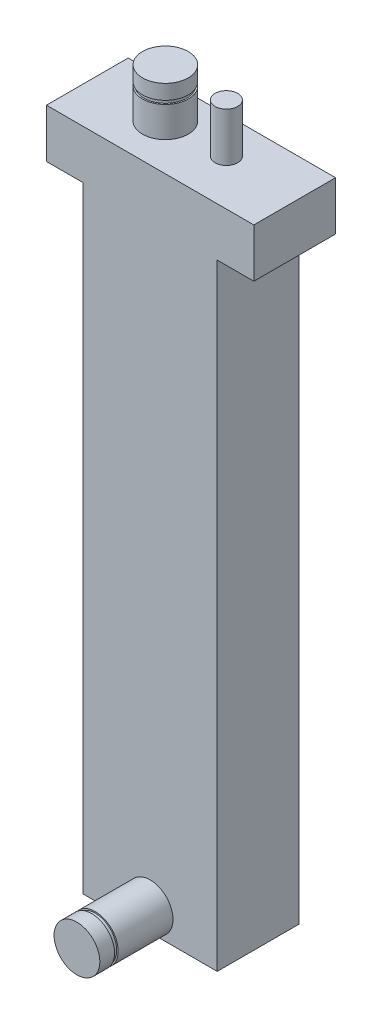
ISO-10303-21;
HEADER;
FILE_DESCRIPTION(('STEP AP214'),'2;1');
FILE_NAME('part.step','',(''),(''),'','','');
FILE_SCHEMA(('AUTOMOTIVE_DESIGN { 1 0 10303 214 1 1 1 1 }'));
ENDSEC;
DATA;
#1=APPLICATION_CONTEXT('core data for automotive mechanical design processes');
#2=APPLICATION_PROTOCOL_DEFINITION('international standard','automotive_design',2000,#1);
#3=PRODUCT_CONTEXT('',#1,'mechanical');
#4=PRODUCT('Part','Part','',(#3));
#5=PRODUCT_RELATED_PRODUCT_CATEGORY('part','',(#4));
#6=PRODUCT_DEFINITION_FORMATION('','',#4);
#7=PRODUCT_DEFINITION_CONTEXT('part definition',#1,'design');
#8=PRODUCT_DEFINITION('design','',#6,#7);
#9=PRODUCT_DEFINITION_SHAPE('','',#8);
#10=(LENGTH_UNIT() NAMED_UNIT(*) SI_UNIT(.MILLI.,.METRE.));
#11=(NAMED_UNIT(*) PLANE_ANGLE_UNIT() SI_UNIT($,.RADIAN.));
#12=(NAMED_UNIT(*) SI_UNIT($,.STERADIAN.) SOLID_ANGLE_UNIT());
#13=UNCERTAINTY_MEASURE_WITH_UNIT(LENGTH_MEASURE(1.E-05),#10,'distance_accuracy_value','');
#14=(GEOMETRIC_REPRESENTATION_CONTEXT(3) GLOBAL_UNCERTAINTY_ASSIGNED_CONTEXT((#13)) GLOBAL_UNIT_ASSIGNED_CONTEXT((#10,
#11,#12)) REPRESENTATION_CONTEXT('',''));
#15=CARTESIAN_POINT('',(0.,0.,0.));
#16=DIRECTION('',(0.,0.,1.));
#17=DIRECTION('',(1.,0.,0.));
#18=AXIS2_PLACEMENT_3D('',#15,#16,#17);
#19=CARTESIAN_POINT('',(-11.43,20.32,0.));
#20=DIRECTION('',(0.,-1.,0.));
#21=DIRECTION('',(0.,0.,-1.));
#22=AXIS2_PLACEMENT_3D('',#19,#20,#21);
#23=CYLINDRICAL_SURFACE('',#22,4.7625);
#24=CARTESIAN_POINT('',(-11.43,10.16,0.));
#25=DIRECTION('',(0.,1.,0.));
#26=DIRECTION('',(0.,0.,1.));
#27=AXIS2_PLACEMENT_3D('',#24,#25,#26);
#28=CIRCLE('',#27,4.7625);
#29=CARTESIAN_POINT('',(-11.43,10.16,4.7625));
#30=VERTEX_POINT('',#29);
#31=EDGE_CURVE('E159',#30,#30,#28,.T.);
#32=ORIENTED_EDGE('',*,*,#31,.T.);
#33=EDGE_LOOP('',(#32));
#34=FACE_BOUND('',#33,.T.);
#35=CARTESIAN_POINT('',(-11.43,16.51,0.));
#36=DIRECTION('',(0.,1.,0.));
#37=DIRECTION('',(0.,0.,1.));
#38=AXIS2_PLACEMENT_3D('',#35,#36,#37);
#39=CIRCLE('',#38,4.7625);
#40=CARTESIAN_POINT('',(-11.43,16.51,4.7625));
#41=VERTEX_POINT('',#40);
#42=EDGE_CURVE('E51',#41,#41,#39,.T.);
#43=ORIENTED_EDGE('',*,*,#42,.F.);
#44=EDGE_LOOP('',(#43));
#45=FACE_BOUND('',#44,.T.);
#46=ADVANCED_FACE('F41',(#34,#45),#23,.T.);
#47=CARTESIAN_POINT('',(-5.07999999999999,-123.5075,24.765));
#48=DIRECTION('',(0.,0.,-1.));
#49=DIRECTION('',(-1.,0.,0.));
#50=AXIS2_PLACEMENT_3D('',#47,#48,#49);
#51=CYLINDRICAL_SURFACE('',#50,4.76249999999999);
#52=CARTESIAN_POINT('',(-5.07999999999999,-123.5075,9.525));
#53=DIRECTION('',(0.,0.,1.));
#54=DIRECTION('',(1.,0.,0.));
#55=AXIS2_PLACEMENT_3D('',#52,#53,#54);
#56=CIRCLE('',#55,4.76249999999999);
#57=CARTESIAN_POINT('',(-5.07999999999999,-128.27,9.525));
#58=VERTEX_POINT('',#57);
#59=EDGE_CURVE('E163',#58,#58,#56,.T.);
#60=ORIENTED_EDGE('',*,*,#59,.T.);
#61=EDGE_LOOP('',(#60));
#62=FACE_BOUND('',#61,.T.);
#63=CARTESIAN_POINT('',(-5.07999999999999,-123.5075,20.955));
#64=DIRECTION('',(0.,0.,1.));
#65=DIRECTION('',(1.,0.,0.));
#66=AXIS2_PLACEMENT_3D('',#63,#64,#65);
#67=CIRCLE('',#66,4.76249999999999);
#68=CARTESIAN_POINT('',(-0.317499999999991,-123.5075,20.955));
#69=VERTEX_POINT('',#68);
#70=EDGE_CURVE('E173',#69,#69,#67,.T.);
#71=ORIENTED_EDGE('',*,*,#70,.F.);
#72=EDGE_LOOP('',(#71));
#73=FACE_BOUND('',#72,.T.);
#74=ADVANCED_FACE('F210',(#62,#73),#51,.T.);
#75=CARTESIAN_POINT('',(0.,0.,0.));
#76=DIRECTION('',(0.,1.,0.));
#77=DIRECTION('',(0.,0.,1.));
#78=AXIS2_PLACEMENT_3D('',#75,#76,#77);
#79=PLANE('',#78);
#80=DIRECTION('',(-1.,0.,0.));
#81=VECTOR('',#80,1.);
#82=CARTESIAN_POINT('',(0.,0.,-7.493));
#83=LINE('',#82,#81);
#84=CARTESIAN_POINT('',(-19.05,0.,-7.493));
#85=VERTEX_POINT('',#84);
#86=CARTESIAN_POINT('',(-26.67,0.,-7.493));
#87=VERTEX_POINT('',#86);
#88=EDGE_CURVE('E101',#85,#87,#83,.T.);
#89=ORIENTED_EDGE('',*,*,#88,.F.);
#90=DIRECTION('',(0.,0.,-1.));
#91=VECTOR('',#90,1.);
#92=CARTESIAN_POINT('',(-19.05,0.,9.525));
#93=LINE('',#92,#91);
#94=CARTESIAN_POINT('',(-19.05,0.,9.525));
#95=VERTEX_POINT('',#94);
#96=EDGE_CURVE('E95',#95,#85,#93,.T.);
#97=ORIENTED_EDGE('',*,*,#96,.F.);
#98=DIRECTION('',(1.,0.,0.));
#99=VECTOR('',#98,1.);
#100=CARTESIAN_POINT('',(11.43,0.,9.52499999999999));
#101=LINE('',#100,#99);
#102=CARTESIAN_POINT('',(-26.67,0.,9.525));
#103=VERTEX_POINT('',#102);
#104=EDGE_CURVE('E99',#103,#95,#101,.T.);
#105=ORIENTED_EDGE('',*,*,#104,.F.);
#106=DIRECTION('',(0.,0.,1.));
#107=VECTOR('',#106,1.);
#108=CARTESIAN_POINT('',(-26.67,0.,-9.525));
#109=LINE('',#108,#107);
#110=EDGE_CURVE('E143',#87,#103,#109,.T.);
#111=ORIENTED_EDGE('',*,*,#110,.F.);
#112=EDGE_LOOP('',(#89,#97,#105,#111));
#113=FACE_BOUND('',#112,.T.);
#114=ADVANCED_FACE('F97',(#113),#79,.F.);
#115=DIRECTION('',(-1.,0.,0.));
#116=VECTOR('',#115,1.);
#117=CARTESIAN_POINT('',(0.,0.,-7.493));
#118=LINE('',#117,#116);
#119=CARTESIAN_POINT('',(16.51,0.,-7.49300000000001));
#120=VERTEX_POINT('',#119);
#121=CARTESIAN_POINT('',(8.89000000000001,0.,-7.49300000000001));
#122=VERTEX_POINT('',#121);
#123=EDGE_CURVE('E230',#120,#122,#118,.T.);
#124=ORIENTED_EDGE('',*,*,#123,.F.);
#125=DIRECTION('',(0.,0.,-1.));
#126=VECTOR('',#125,1.);
#127=CARTESIAN_POINT('',(16.51,0.,9.52499999999999));
#128=LINE('',#127,#126);
#129=CARTESIAN_POINT('',(16.51,0.,9.52499999999999));
#130=VERTEX_POINT('',#129);
#131=EDGE_CURVE('E136',#130,#120,#128,.T.);
#132=ORIENTED_EDGE('',*,*,#131,.F.);
#133=CARTESIAN_POINT('',(8.89000000000001,0.,9.525));
#134=VERTEX_POINT('',#133);
#135=EDGE_CURVE('E117',#134,#130,#101,.T.);
#136=ORIENTED_EDGE('',*,*,#135,.F.);
#137=DIRECTION('',(0.,0.,1.));
#138=VECTOR('',#137,1.);
#139=CARTESIAN_POINT('',(8.89000000000001,0.,9.525));
#140=LINE('',#139,#138);
#141=EDGE_CURVE('E105',#122,#134,#140,.T.);
#142=ORIENTED_EDGE('',*,*,#141,.F.);
#143=EDGE_LOOP('',(#124,#132,#136,#142));
#144=FACE_BOUND('',#143,.T.);
#145=ADVANCED_FACE('F308',(#144),#79,.F.);
#146=CARTESIAN_POINT('',(0.,10.16,0.));
#147=DIRECTION('',(0.,1.,0.));
#148=DIRECTION('',(0.,0.,1.));
#149=AXIS2_PLACEMENT_3D('',#146,#147,#148);
#150=PLANE('',#149);
#151=CARTESIAN_POINT('',(1.27000000000001,10.16,0.));
#152=DIRECTION('',(0.,1.,0.));
#153=DIRECTION('',(0.,0.,1.));
#154=AXIS2_PLACEMENT_3D('',#151,#152,#153);
#155=CIRCLE('',#154,2.35729593622905);
#156=CARTESIAN_POINT('',(1.27000000000001,10.16,2.35729593622905));
#157=VERTEX_POINT('',#156);
#158=EDGE_CURVE('E116',#157,#157,#155,.T.);
#159=ORIENTED_EDGE('',*,*,#158,.F.);
#160=EDGE_LOOP('',(#159));
#161=FACE_BOUND('',#160,.T.);
#162=ORIENTED_EDGE('',*,*,#31,.F.);
#163=EDGE_LOOP('',(#162));
#164=FACE_BOUND('',#163,.T.);
#165=DIRECTION('',(0.,0.,1.));
#166=VECTOR('',#165,1.);
#167=CARTESIAN_POINT('',(16.51,10.16,9.52499999999999));
#168=LINE('',#167,#166);
#169=CARTESIAN_POINT('',(16.51,10.16,-7.49300000000001));
#170=VERTEX_POINT('',#169);
#171=CARTESIAN_POINT('',(16.51,10.16,9.52499999999999));
#172=VERTEX_POINT('',#171);
#173=EDGE_CURVE('E127',#170,#172,#168,.T.);
#174=ORIENTED_EDGE('',*,*,#173,.F.);
#175=DIRECTION('',(1.,0.,0.));
#176=VECTOR('',#175,1.);
#177=CARTESIAN_POINT('',(16.51,10.16,-7.49300000000001));
#178=LINE('',#177,#176);
#179=CARTESIAN_POINT('',(-26.67,10.16,-7.493));
#180=VERTEX_POINT('',#179);
#181=EDGE_CURVE('E231',#180,#170,#178,.T.);
#182=ORIENTED_EDGE('',*,*,#181,.F.);
#183=DIRECTION('',(0.,0.,-1.));
#184=VECTOR('',#183,1.);
#185=CARTESIAN_POINT('',(-26.67,10.16,-9.525));
#186=LINE('',#185,#184);
#187=CARTESIAN_POINT('',(-26.67,10.16,9.525));
#188=VERTEX_POINT('',#187);
#189=EDGE_CURVE('E140',#188,#180,#186,.T.);
#190=ORIENTED_EDGE('',*,*,#189,.F.);
#191=DIRECTION('',(1.,0.,0.));
#192=VECTOR('',#191,1.);
#193=CARTESIAN_POINT('',(11.43,10.16,9.52499999999999));
#194=LINE('',#193,#192);
#195=EDGE_CURVE('E146',#188,#172,#194,.T.);
#196=ORIENTED_EDGE('',*,*,#195,.T.);
#197=EDGE_LOOP('',(#174,#182,#190,#196));
#198=FACE_BOUND('',#197,.T.);
#199=ADVANCED_FACE('F297',(#161,#164,#198),#150,.T.);
#200=CARTESIAN_POINT('',(-26.67,0.,0.));
#201=DIRECTION('',(1.,0.,0.));
#202=DIRECTION('',(0.,0.,-1.));
#203=AXIS2_PLACEMENT_3D('',#200,#201,#202);
#204=PLANE('',#203);
#205=DIRECTION('',(0.,1.,0.));
#206=VECTOR('',#205,1.);
#207=CARTESIAN_POINT('',(-26.67,10.16,-7.493));
#208=LINE('',#207,#206);
#209=EDGE_CURVE('E232',#87,#180,#208,.T.);
#210=ORIENTED_EDGE('',*,*,#209,.F.);
#211=ORIENTED_EDGE('',*,*,#110,.T.);
#212=DIRECTION('',(0.,1.,0.));
#213=VECTOR('',#212,1.);
#214=CARTESIAN_POINT('',(-26.67,0.,9.525));
#215=LINE('',#214,#213);
#216=EDGE_CURVE('E114',#103,#188,#215,.T.);
#217=ORIENTED_EDGE('',*,*,#216,.T.);
#218=ORIENTED_EDGE('',*,*,#189,.T.);
#219=EDGE_LOOP('',(#210,#211,#217,#218));
#220=FACE_BOUND('',#219,.T.);
#221=ADVANCED_FACE('F293',(#220),#204,.F.);
#222=CARTESIAN_POINT('',(16.51,0.,0.));
#223=DIRECTION('',(1.,0.,0.));
#224=DIRECTION('',(0.,0.,-1.));
#225=AXIS2_PLACEMENT_3D('',#222,#223,#224);
#226=PLANE('',#225);
#227=ORIENTED_EDGE('',*,*,#131,.T.);
#228=DIRECTION('',(0.,-1.,0.));
#229=VECTOR('',#228,1.);
#230=CARTESIAN_POINT('',(16.51,10.16,-7.49300000000001));
#231=LINE('',#230,#229);
#232=EDGE_CURVE('E226',#170,#120,#231,.T.);
#233=ORIENTED_EDGE('',*,*,#232,.F.);
#234=ORIENTED_EDGE('',*,*,#173,.T.);
#235=DIRECTION('',(0.,-1.,0.));
#236=VECTOR('',#235,1.);
#237=CARTESIAN_POINT('',(16.51,10.16,9.52499999999999));
#238=LINE('',#237,#236);
#239=EDGE_CURVE('E123',#172,#130,#238,.T.);
#240=ORIENTED_EDGE('',*,*,#239,.T.);
#241=EDGE_LOOP('',(#227,#233,#234,#240));
#242=FACE_BOUND('',#241,.T.);
#243=ADVANCED_FACE('F290',(#242),#226,.T.);
#244=CARTESIAN_POINT('',(-19.05,-128.27,9.525));
#245=DIRECTION('',(1.,0.,0.));
#246=DIRECTION('',(0.,0.,-1.));
#247=AXIS2_PLACEMENT_3D('',#244,#245,#246);
#248=PLANE('',#247);
#249=DIRECTION('',(0.,1.,0.));
#250=VECTOR('',#249,1.);
#251=CARTESIAN_POINT('',(-19.05,-128.27,-7.493));
#252=LINE('',#251,#250);
#253=CARTESIAN_POINT('',(-19.05,-128.27,-7.493));
#254=VERTEX_POINT('',#253);
#255=EDGE_CURVE('E60',#254,#85,#252,.T.);
#256=ORIENTED_EDGE('',*,*,#255,.F.);
#257=DIRECTION('',(0.,0.,-1.));
#258=VECTOR('',#257,1.);
#259=CARTESIAN_POINT('',(-19.05,-128.27,9.525));
#260=LINE('',#259,#258);
#261=CARTESIAN_POINT('',(-19.05,-128.27,9.525));
#262=VERTEX_POINT('',#261);
#263=EDGE_CURVE('E121',#262,#254,#260,.T.);
#264=ORIENTED_EDGE('',*,*,#263,.F.);
#265=DIRECTION('',(0.,1.,0.));
#266=VECTOR('',#265,1.);
#267=CARTESIAN_POINT('',(-19.05,-128.27,9.525));
#268=LINE('',#267,#266);
#269=EDGE_CURVE('E106',#262,#95,#268,.T.);
#270=ORIENTED_EDGE('',*,*,#269,.T.);
#271=ORIENTED_EDGE('',*,*,#96,.T.);
#272=EDGE_LOOP('',(#256,#264,#270,#271));
#273=FACE_BOUND('',#272,.T.);
#274=ADVANCED_FACE('F119',(#273),#248,.F.);
#275=CARTESIAN_POINT('',(8.89000000000001,-128.27,9.525));
#276=DIRECTION('',(-1.,0.,0.));
#277=DIRECTION('',(0.,0.,1.));
#278=AXIS2_PLACEMENT_3D('',#275,#276,#277);
#279=PLANE('',#278);
#280=DIRECTION('',(0.,-1.,0.));
#281=VECTOR('',#280,1.);
#282=CARTESIAN_POINT('',(8.89000000000001,-128.27,-7.493));
#283=LINE('',#282,#281);
#284=CARTESIAN_POINT('',(8.89000000000001,-128.27,-7.493));
#285=VERTEX_POINT('',#284);
#286=EDGE_CURVE('E239',#122,#285,#283,.T.);
#287=ORIENTED_EDGE('',*,*,#286,.F.);
#288=ORIENTED_EDGE('',*,*,#141,.T.);
#289=DIRECTION('',(0.,1.,0.));
#290=VECTOR('',#289,1.);
#291=CARTESIAN_POINT('',(8.89000000000001,-128.27,9.525));
#292=LINE('',#291,#290);
#293=CARTESIAN_POINT('',(8.89000000000001,-128.27,9.525));
#294=VERTEX_POINT('',#293);
#295=EDGE_CURVE('E131',#294,#134,#292,.T.);
#296=ORIENTED_EDGE('',*,*,#295,.F.);
#297=DIRECTION('',(0.,0.,1.));
#298=VECTOR('',#297,1.);
#299=CARTESIAN_POINT('',(8.89000000000001,-128.27,9.525));
#300=LINE('',#299,#298);
#301=EDGE_CURVE('E172',#285,#294,#300,.T.);
#302=ORIENTED_EDGE('',*,*,#301,.F.);
#303=EDGE_LOOP('',(#287,#288,#296,#302));
#304=FACE_BOUND('',#303,.T.);
#305=ADVANCED_FACE('F284',(#304),#279,.F.);
#306=CARTESIAN_POINT('',(0.,-128.27,0.));
#307=DIRECTION('',(0.,-1.,0.));
#308=DIRECTION('',(0.,0.,-1.));
#309=AXIS2_PLACEMENT_3D('',#306,#307,#308);
#310=PLANE('',#309);
#311=ORIENTED_EDGE('',*,*,#263,.T.);
#312=DIRECTION('',(1.,0.,0.));
#313=VECTOR('',#312,1.);
#314=CARTESIAN_POINT('',(0.,-128.27,-7.493));
#315=LINE('',#314,#313);
#316=EDGE_CURVE('E168',#254,#285,#315,.T.);
#317=ORIENTED_EDGE('',*,*,#316,.T.);
#318=ORIENTED_EDGE('',*,*,#301,.T.);
#319=DIRECTION('',(-1.,0.,0.));
#320=VECTOR('',#319,1.);
#321=CARTESIAN_POINT('',(-19.05,-128.27,9.525));
#322=LINE('',#321,#320);
#323=EDGE_CURVE('E257',#294,#58,#322,.T.);
#324=ORIENTED_EDGE('',*,*,#323,.T.);
#325=EDGE_CURVE('E134',#58,#262,#322,.T.);
#326=ORIENTED_EDGE('',*,*,#325,.T.);
#327=EDGE_LOOP('',(#311,#317,#318,#324,#326));
#328=FACE_BOUND('',#327,.T.);
#329=ADVANCED_FACE('F262',(#328),#310,.T.);
#330=CARTESIAN_POINT('',(11.43,10.16,9.52499999999999));
#331=DIRECTION('',(0.,0.,-1.));
#332=DIRECTION('',(-1.,0.,0.));
#333=AXIS2_PLACEMENT_3D('',#330,#331,#332);
#334=PLANE('',#333);
#335=ORIENTED_EDGE('',*,*,#325,.F.);
#336=ORIENTED_EDGE('',*,*,#59,.F.);
#337=ORIENTED_EDGE('',*,*,#323,.F.);
#338=ORIENTED_EDGE('',*,*,#295,.T.);
#339=ORIENTED_EDGE('',*,*,#135,.T.);
#340=ORIENTED_EDGE('',*,*,#239,.F.);
#341=ORIENTED_EDGE('',*,*,#195,.F.);
#342=ORIENTED_EDGE('',*,*,#216,.F.);
#343=ORIENTED_EDGE('',*,*,#104,.T.);
#344=ORIENTED_EDGE('',*,*,#269,.F.);
#345=EDGE_LOOP('',(#335,#336,#337,#338,#339,#340,#341,#342,#343,#344));
#346=FACE_BOUND('',#345,.T.);
#347=ADVANCED_FACE('F111',(#346),#334,.F.);
#348=CARTESIAN_POINT('',(1.27000000000001,20.32,0.));
#349=DIRECTION('',(0.,-1.,0.));
#350=DIRECTION('',(0.,0.,-1.));
#351=AXIS2_PLACEMENT_3D('',#348,#349,#350);
#352=CYLINDRICAL_SURFACE('',#351,2.35729593622905);
#353=CARTESIAN_POINT('',(1.27000000000001,20.32,0.));
#354=DIRECTION('',(0.,1.,0.));
#355=DIRECTION('',(0.,0.,1.));
#356=AXIS2_PLACEMENT_3D('',#353,#354,#355);
#357=CIRCLE('',#356,2.35729593622905);
#358=CARTESIAN_POINT('',(1.27000000000001,20.32,2.35729593622905));
#359=VERTEX_POINT('',#358);
#360=EDGE_CURVE('E152',#359,#359,#357,.T.);
#361=ORIENTED_EDGE('',*,*,#360,.F.);
#362=EDGE_LOOP('',(#361));
#363=FACE_BOUND('',#362,.T.);
#364=ORIENTED_EDGE('',*,*,#158,.T.);
#365=EDGE_LOOP('',(#364));
#366=FACE_BOUND('',#365,.T.);
#367=ADVANCED_FACE('F301',(#363,#366),#352,.T.);
#368=CARTESIAN_POINT('',(1.27000000000001,20.32,0.));
#369=DIRECTION('',(0.,1.,0.));
#370=DIRECTION('',(0.,0.,1.));
#371=AXIS2_PLACEMENT_3D('',#368,#369,#370);
#372=PLANE('',#371);
#373=ORIENTED_EDGE('',*,*,#360,.T.);
#374=EDGE_LOOP('',(#373));
#375=FACE_BOUND('',#374,.T.);
#376=ADVANCED_FACE('F277',(#375),#372,.T.);
#377=CARTESIAN_POINT('',(0.,0.,-7.493));
#378=DIRECTION('',(0.,0.,-1.));
#379=DIRECTION('',(-1.,0.,0.));
#380=AXIS2_PLACEMENT_3D('',#377,#378,#379);
#381=PLANE('',#380);
#382=ORIENTED_EDGE('',*,*,#88,.T.);
#383=ORIENTED_EDGE('',*,*,#209,.T.);
#384=ORIENTED_EDGE('',*,*,#181,.T.);
#385=ORIENTED_EDGE('',*,*,#232,.T.);
#386=ORIENTED_EDGE('',*,*,#123,.T.);
#387=ORIENTED_EDGE('',*,*,#286,.T.);
#388=ORIENTED_EDGE('',*,*,#316,.F.);
#389=ORIENTED_EDGE('',*,*,#255,.T.);
#390=EDGE_LOOP('',(#382,#383,#384,#385,#386,#387,#388,#389));
#391=FACE_BOUND('',#390,.T.);
#392=ADVANCED_FACE('F269',(#391),#381,.T.);
#393=CARTESIAN_POINT('',(0.,0.,20.955));
#394=DIRECTION('',(0.,0.,1.));
#395=DIRECTION('',(1.,0.,0.));
#396=AXIS2_PLACEMENT_3D('',#393,#394,#395);
#397=PLANE('',#396);
#398=CARTESIAN_POINT('',(-5.07999999999999,-123.5075,20.955));
#399=DIRECTION('',(0.,0.,1.));
#400=DIRECTION('',(1.,0.,0.));
#401=AXIS2_PLACEMENT_3D('',#398,#399,#400);
#402=CIRCLE('',#401,4.4704);
#403=CARTESIAN_POINT('',(-0.609599999999987,-123.5075,20.955));
#404=VERTEX_POINT('',#403);
#405=EDGE_CURVE('E177',#404,#404,#402,.T.);
#406=ORIENTED_EDGE('',*,*,#405,.F.);
#407=EDGE_LOOP('',(#406));
#408=FACE_BOUND('',#407,.T.);
#409=ORIENTED_EDGE('',*,*,#70,.T.);
#410=EDGE_LOOP('',(#409));
#411=FACE_BOUND('',#410,.T.);
#412=ADVANCED_FACE('F267',(#408,#411),#397,.T.);
#413=CARTESIAN_POINT('',(-5.07999999999999,-123.5075,34.3358006184653));
#414=DIRECTION('',(0.,0.,-1.));
#415=DIRECTION('',(-1.,0.,0.));
#416=AXIS2_PLACEMENT_3D('',#413,#414,#415);
#417=CYLINDRICAL_SURFACE('',#416,4.4704);
#418=ORIENTED_EDGE('',*,*,#405,.T.);
#419=EDGE_LOOP('',(#418));
#420=FACE_BOUND('',#419,.T.);
#421=CARTESIAN_POINT('',(-5.07999999999999,-123.5075,21.6916));
#422=DIRECTION('',(0.,0.,1.));
#423=DIRECTION('',(1.,0.,0.));
#424=AXIS2_PLACEMENT_3D('',#421,#422,#423);
#425=CIRCLE('',#424,4.4704);
#426=CARTESIAN_POINT('',(-0.609599999999987,-123.5075,21.6916));
#427=VERTEX_POINT('',#426);
#428=EDGE_CURVE('E178',#427,#427,#425,.T.);
#429=ORIENTED_EDGE('',*,*,#428,.F.);
#430=EDGE_LOOP('',(#429));
#431=FACE_BOUND('',#430,.T.);
#432=ADVANCED_FACE('F206',(#420,#431),#417,.T.);
#433=CARTESIAN_POINT('',(-5.07999999999999,-123.5075,24.765));
#434=DIRECTION('',(0.,0.,1.));
#435=DIRECTION('',(1.,0.,0.));
#436=AXIS2_PLACEMENT_3D('',#433,#434,#435);
#437=PLANE('',#436);
#438=CARTESIAN_POINT('',(-5.07999999999999,-123.5075,24.765));
#439=DIRECTION('',(0.,0.,1.));
#440=DIRECTION('',(1.,0.,0.));
#441=AXIS2_PLACEMENT_3D('',#438,#439,#440);
#442=CIRCLE('',#441,4.76249999999999);
#443=CARTESIAN_POINT('',(-9.84249999999998,-123.5075,24.765));
#444=VERTEX_POINT('',#443);
#445=EDGE_CURVE('E44',#444,#444,#442,.T.);
#446=ORIENTED_EDGE('',*,*,#445,.T.);
#447=EDGE_LOOP('',(#446));
#448=FACE_BOUND('',#447,.T.);
#449=ADVANCED_FACE('F193',(#448),#437,.T.);
#450=CARTESIAN_POINT('',(-5.07999999999999,-123.5075,24.765));
#451=DIRECTION('',(0.,0.,-1.));
#452=DIRECTION('',(-1.,0.,0.));
#453=AXIS2_PLACEMENT_3D('',#450,#451,#452);
#454=CYLINDRICAL_SURFACE('',#453,4.76249999999999);
#455=CARTESIAN_POINT('',(-5.07999999999999,-123.5075,21.6916));
#456=DIRECTION('',(0.,0.,1.));
#457=DIRECTION('',(1.,0.,0.));
#458=AXIS2_PLACEMENT_3D('',#455,#456,#457);
#459=CIRCLE('',#458,4.76249999999999);
#460=CARTESIAN_POINT('',(-9.84249999999998,-123.5075,21.6916));
#461=VERTEX_POINT('',#460);
#462=EDGE_CURVE('E182',#461,#461,#459,.T.);
#463=CARTESIAN_POINT('',(-9.84249999999998,-123.5075,21.6916));
#464=CARTESIAN_POINT('',(-9.84249999999998,-123.5075,21.7236145833333));
#465=CARTESIAN_POINT('',(-9.84249999999998,-123.5075,21.7556291666667));
#466=CARTESIAN_POINT('',(-9.84249999999998,-123.5075,21.8196583333333));
#467=CARTESIAN_POINT('',(-9.84249999999998,-123.5075,21.8516729166667));
#468=CARTESIAN_POINT('',(-9.84249999999998,-123.5075,21.9157020833333));
#469=CARTESIAN_POINT('',(-9.84249999999998,-123.5075,21.9477166666667));
#470=CARTESIAN_POINT('',(-9.84249999999998,-123.5075,22.0117458333333));
#471=CARTESIAN_POINT('',(-9.84249999999998,-123.5075,22.0437604166667));
#472=CARTESIAN_POINT('',(-9.84249999999998,-123.5075,22.1077895833333));
#473=CARTESIAN_POINT('',(-9.84249999999998,-123.5075,22.1398041666667));
#474=CARTESIAN_POINT('',(-9.84249999999998,-123.5075,22.2038333333333));
#475=CARTESIAN_POINT('',(-9.84249999999998,-123.5075,22.2358479166667));
#476=CARTESIAN_POINT('',(-9.84249999999998,-123.5075,22.2998770833333));
#477=CARTESIAN_POINT('',(-9.84249999999998,-123.5075,22.3318916666667));
#478=CARTESIAN_POINT('',(-9.84249999999998,-123.5075,22.3959208333333));
#479=CARTESIAN_POINT('',(-9.84249999999998,-123.5075,22.4279354166667));
#480=CARTESIAN_POINT('',(-9.84249999999998,-123.5075,22.4919645833333));
#481=CARTESIAN_POINT('',(-9.84249999999998,-123.5075,22.5239791666667));
#482=CARTESIAN_POINT('',(-9.84249999999998,-123.5075,22.5880083333333));
#483=CARTESIAN_POINT('',(-9.84249999999998,-123.5075,22.6200229166667));
#484=CARTESIAN_POINT('',(-9.84249999999998,-123.5075,22.6840520833333));
#485=CARTESIAN_POINT('',(-9.84249999999998,-123.5075,22.7160666666667));
#486=CARTESIAN_POINT('',(-9.84249999999998,-123.5075,22.7800958333333));
#487=CARTESIAN_POINT('',(-9.84249999999998,-123.5075,22.8121104166667));
#488=CARTESIAN_POINT('',(-9.84249999999998,-123.5075,22.8761395833333));
#489=CARTESIAN_POINT('',(-9.84249999999998,-123.5075,22.9081541666667));
#490=CARTESIAN_POINT('',(-9.84249999999998,-123.5075,22.9721833333333));
#491=CARTESIAN_POINT('',(-9.84249999999998,-123.5075,23.0041979166667));
#492=CARTESIAN_POINT('',(-9.84249999999998,-123.5075,23.0682270833333));
#493=CARTESIAN_POINT('',(-9.84249999999998,-123.5075,23.1002416666667));
#494=CARTESIAN_POINT('',(-9.84249999999998,-123.5075,23.1642708333333));
#495=CARTESIAN_POINT('',(-9.84249999999998,-123.5075,23.1962854166667));
#496=CARTESIAN_POINT('',(-9.84249999999998,-123.5075,23.2603145833333));
#497=CARTESIAN_POINT('',(-9.84249999999998,-123.5075,23.2923291666667));
#498=CARTESIAN_POINT('',(-9.84249999999998,-123.5075,23.3563583333333));
#499=CARTESIAN_POINT('',(-9.84249999999998,-123.5075,23.3883729166667));
#500=CARTESIAN_POINT('',(-9.84249999999998,-123.5075,23.4524020833333));
#501=CARTESIAN_POINT('',(-9.84249999999998,-123.5075,23.4844166666667));
#502=CARTESIAN_POINT('',(-9.84249999999998,-123.5075,23.5484458333333));
#503=CARTESIAN_POINT('',(-9.84249999999998,-123.5075,23.5804604166667));
#504=CARTESIAN_POINT('',(-9.84249999999998,-123.5075,23.6444895833333));
#505=CARTESIAN_POINT('',(-9.84249999999998,-123.5075,23.6765041666667));
#506=CARTESIAN_POINT('',(-9.84249999999998,-123.5075,23.7405333333333));
#507=CARTESIAN_POINT('',(-9.84249999999998,-123.5075,23.7725479166667));
#508=CARTESIAN_POINT('',(-9.84249999999998,-123.5075,23.8365770833333));
#509=CARTESIAN_POINT('',(-9.84249999999998,-123.5075,23.8685916666667));
#510=CARTESIAN_POINT('',(-9.84249999999998,-123.5075,23.9326208333333));
#511=CARTESIAN_POINT('',(-9.84249999999998,-123.5075,23.9646354166667));
#512=CARTESIAN_POINT('',(-9.84249999999998,-123.5075,24.0286645833333));
#513=CARTESIAN_POINT('',(-9.84249999999998,-123.5075,24.0606791666667));
#514=CARTESIAN_POINT('',(-9.84249999999998,-123.5075,24.1247083333333));
#515=CARTESIAN_POINT('',(-9.84249999999998,-123.5075,24.1567229166667));
#516=CARTESIAN_POINT('',(-9.84249999999998,-123.5075,24.2207520833333));
#517=CARTESIAN_POINT('',(-9.84249999999998,-123.5075,24.2527666666667));
#518=CARTESIAN_POINT('',(-9.84249999999998,-123.5075,24.3167958333333));
#519=CARTESIAN_POINT('',(-9.84249999999998,-123.5075,24.3488104166667));
#520=CARTESIAN_POINT('',(-9.84249999999998,-123.5075,24.4128395833333));
#521=CARTESIAN_POINT('',(-9.84249999999998,-123.5075,24.4448541666667));
#522=CARTESIAN_POINT('',(-9.84249999999998,-123.5075,24.5088833333333));
#523=CARTESIAN_POINT('',(-9.84249999999998,-123.5075,24.5408979166667));
#524=CARTESIAN_POINT('',(-9.84249999999998,-123.5075,24.6049270833333));
#525=CARTESIAN_POINT('',(-9.84249999999998,-123.5075,24.6369416666667));
#526=CARTESIAN_POINT('',(-9.84249999999998,-123.5075,24.7009708333333));
#527=CARTESIAN_POINT('',(-9.84249999999998,-123.5075,24.7329854166667));
#528=CARTESIAN_POINT('',(-9.84249999999998,-123.5075,24.765));
#529=B_SPLINE_CURVE_WITH_KNOTS('',3,(#463,#464,#465,#466,#467,#468,#469,#470,#471,#472,#473,
#474,#475,#476,#477,#478,#479,#480,#481,#482,#483,#484,#485,#486,#487,#488,#489,#490,#491,#492,
#493,#494,#495,#496,#497,#498,#499,#500,#501,#502,#503,#504,#505,#506,#507,#508,#509,#510,#511,
#512,#513,#514,#515,#516,#517,#518,#519,#520,#521,#522,#523,#524,#525,#526,#527,#528),
.UNSPECIFIED.,.F.,.F.,(4,2,2,2,2,2,2,2,2,2,2,2,2,2,2,2,2,2,2,2,2,2,2,2,2,2,2,2,2,2,2,2,4),(0.,
0.0960437500000001,0.1920875,0.28813125,0.384175,0.480218750000001,0.576262500000001,
0.672306250000001,0.768350000000001,0.864393750000001,0.960437500000001,1.05648125,1.152525,
1.24856875,1.3446125,1.44065625,1.5367,1.63274375,1.7287875,1.82483125,1.920875,2.01691875,
2.1129625,2.20900625,2.30505,2.40109375,2.4971375,2.59318125,2.689225,2.78526875,
2.88131250000001,2.97735625000001,3.07340000000001),.UNSPECIFIED.);
#530=EDGE_CURVE('BSEAM195',#461,#444,#529,.T.);
#531=ORIENTED_EDGE('',*,*,#462,.T.);
#532=ORIENTED_EDGE('',*,*,#445,.F.);
#533=ORIENTED_EDGE('',*,*,#530,.T.);
#534=ORIENTED_EDGE('',*,*,#530,.F.);
#535=EDGE_LOOP('',(#531,#533,#532,#534));
#536=FACE_BOUND('',#535,.T.);
#537=ADVANCED_FACE('F195',(#536),#454,.T.);
#538=CARTESIAN_POINT('',(0.,0.,21.6916));
#539=DIRECTION('',(0.,0.,1.));
#540=DIRECTION('',(1.,0.,0.));
#541=AXIS2_PLACEMENT_3D('',#538,#539,#540);
#542=PLANE('',#541);
#543=ORIENTED_EDGE('',*,*,#428,.T.);
#544=EDGE_LOOP('',(#543));
#545=FACE_BOUND('',#544,.T.);
#546=ORIENTED_EDGE('',*,*,#462,.F.);
#547=EDGE_LOOP('',(#546));
#548=FACE_BOUND('',#547,.T.);
#549=ADVANCED_FACE('F197',(#545,#548),#542,.F.);
#550=CARTESIAN_POINT('',(0.,16.51,0.));
#551=DIRECTION('',(0.,1.,0.));
#552=DIRECTION('',(0.,0.,1.));
#553=AXIS2_PLACEMENT_3D('',#550,#551,#552);
#554=PLANE('',#553);
#555=CARTESIAN_POINT('',(-11.43,16.51,0.));
#556=DIRECTION('',(0.,1.,0.));
#557=DIRECTION('',(0.,0.,1.));
#558=AXIS2_PLACEMENT_3D('',#555,#556,#557);
#559=CIRCLE('',#558,4.4704);
#560=CARTESIAN_POINT('',(-11.43,16.51,4.4704));
#561=VERTEX_POINT('',#560);
#562=EDGE_CURVE('E12',#561,#561,#559,.T.);
#563=ORIENTED_EDGE('',*,*,#562,.F.);
#564=EDGE_LOOP('',(#563));
#565=FACE_BOUND('',#564,.T.);
#566=ORIENTED_EDGE('',*,*,#42,.T.);
#567=EDGE_LOOP('',(#566));
#568=FACE_BOUND('',#567,.T.);
#569=ADVANCED_FACE('F203',(#565,#568),#554,.T.);
#570=CARTESIAN_POINT('',(-11.43,29.8908006184654,0.));
#571=DIRECTION('',(0.,-1.,0.));
#572=DIRECTION('',(0.,0.,-1.));
#573=AXIS2_PLACEMENT_3D('',#570,#571,#572);
#574=CYLINDRICAL_SURFACE('',#573,4.4704);
#575=ORIENTED_EDGE('',*,*,#562,.T.);
#576=EDGE_LOOP('',(#575));
#577=FACE_BOUND('',#576,.T.);
#578=CARTESIAN_POINT('',(-11.43,17.2466,0.));
#579=DIRECTION('',(0.,1.,0.));
#580=DIRECTION('',(0.,0.,1.));
#581=AXIS2_PLACEMENT_3D('',#578,#579,#580);
#582=CIRCLE('',#581,4.4704);
#583=CARTESIAN_POINT('',(-11.43,17.2466,4.4704));
#584=VERTEX_POINT('',#583);
#585=EDGE_CURVE('E164',#584,#584,#582,.T.);
#586=ORIENTED_EDGE('',*,*,#585,.F.);
#587=EDGE_LOOP('',(#586));
#588=FACE_BOUND('',#587,.T.);
#589=ADVANCED_FACE('F364',(#577,#588),#574,.T.);
#590=CARTESIAN_POINT('',(-11.43,20.32,0.));
#591=DIRECTION('',(0.,1.,0.));
#592=DIRECTION('',(0.,0.,1.));
#593=AXIS2_PLACEMENT_3D('',#590,#591,#592);
#594=PLANE('',#593);
#595=CARTESIAN_POINT('',(-11.43,20.32,0.));
#596=DIRECTION('',(0.,1.,0.));
#597=DIRECTION('',(0.,0.,1.));
#598=AXIS2_PLACEMENT_3D('',#595,#596,#597);
#599=CIRCLE('',#598,4.7625);
#600=CARTESIAN_POINT('',(-11.43,20.32,4.7625));
#601=VERTEX_POINT('',#600);
#602=EDGE_CURVE('E413',#601,#601,#599,.T.);
#603=ORIENTED_EDGE('',*,*,#602,.T.);
#604=EDGE_LOOP('',(#603));
#605=FACE_BOUND('',#604,.T.);
#606=ADVANCED_FACE('F374',(#605),#594,.T.);
#607=CARTESIAN_POINT('',(-11.43,20.32,0.));
#608=DIRECTION('',(0.,-1.,0.));
#609=DIRECTION('',(0.,0.,-1.));
#610=AXIS2_PLACEMENT_3D('',#607,#608,#609);
#611=CYLINDRICAL_SURFACE('',#610,4.7625);
#612=CARTESIAN_POINT('',(-11.43,17.2466,0.));
#613=DIRECTION('',(0.,1.,0.));
#614=DIRECTION('',(0.,0.,1.));
#615=AXIS2_PLACEMENT_3D('',#612,#613,#614);
#616=CIRCLE('',#615,4.7625);
#617=CARTESIAN_POINT('',(-11.43,17.2466,4.7625));
#618=VERTEX_POINT('',#617);
#619=EDGE_CURVE('E411',#618,#618,#616,.T.);
#620=ORIENTED_EDGE('',*,*,#619,.T.);
#621=EDGE_LOOP('',(#620));
#622=FACE_BOUND('',#621,.T.);
#623=ORIENTED_EDGE('',*,*,#602,.F.);
#624=EDGE_LOOP('',(#623));
#625=FACE_BOUND('',#624,.T.);
#626=ADVANCED_FACE('F383',(#622,#625),#611,.T.);
#627=CARTESIAN_POINT('',(0.,17.2466,0.));
#628=DIRECTION('',(0.,1.,0.));
#629=DIRECTION('',(0.,0.,1.));
#630=AXIS2_PLACEMENT_3D('',#627,#628,#629);
#631=PLANE('',#630);
#632=ORIENTED_EDGE('',*,*,#585,.T.);
#633=EDGE_LOOP('',(#632));
#634=FACE_BOUND('',#633,.T.);
#635=ORIENTED_EDGE('',*,*,#619,.F.);
#636=EDGE_LOOP('',(#635));
#637=FACE_BOUND('',#636,.T.);
#638=ADVANCED_FACE('F393',(#634,#637),#631,.F.);
#639=CLOSED_SHELL('',(#46,#74,#114,#145,#199,#221,#243,#274,#305,#329,#347,#367,#376,#392,#412,
#432,#449,#537,#549,#569,#589,#606,#626,#638));
#640=MANIFOLD_SOLID_BREP('B2',#639);
#641=ADVANCED_BREP_SHAPE_REPRESENTATION('',(#18,#640),#14);
#642=SHAPE_DEFINITION_REPRESENTATION(#9,#641);
ENDSEC;
END-ISO-10303-21;
